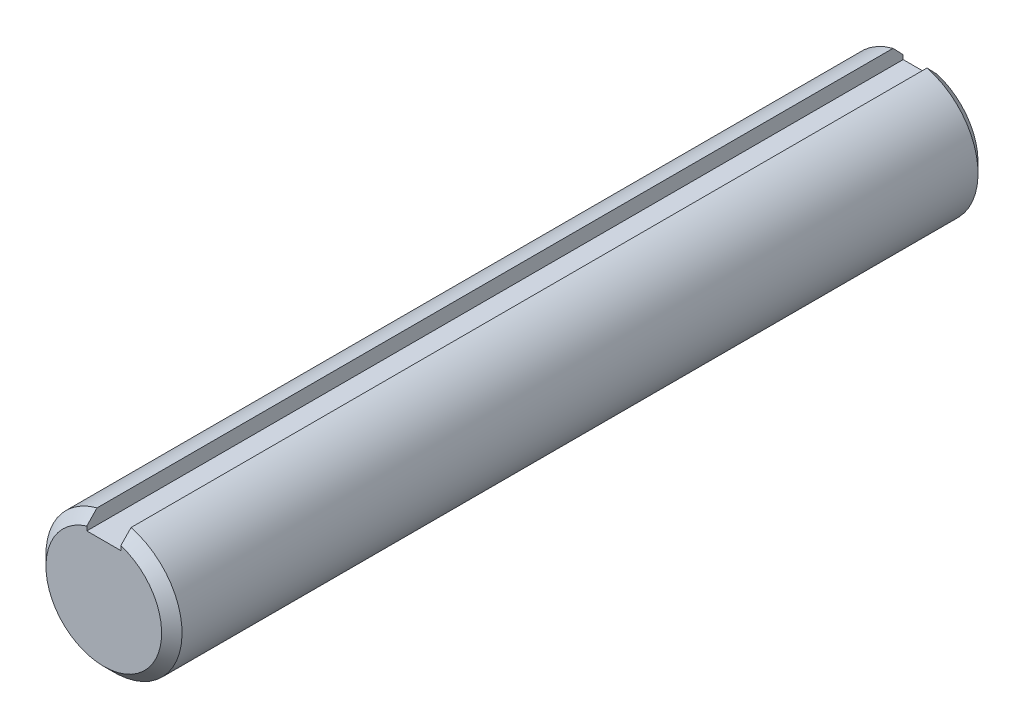
ISO-10303-21;
HEADER;
FILE_DESCRIPTION(('STEP AP214'),'2;1');
FILE_NAME('part.step','',(''),(''),'','','');
FILE_SCHEMA(('AUTOMOTIVE_DESIGN { 1 0 10303 214 1 1 1 1 }'));
ENDSEC;
DATA;
#1=APPLICATION_CONTEXT('core data for automotive mechanical design processes');
#2=APPLICATION_PROTOCOL_DEFINITION('international standard','automotive_design',2000,#1);
#3=PRODUCT_CONTEXT('',#1,'mechanical');
#4=PRODUCT('Part','Part','',(#3));
#5=PRODUCT_RELATED_PRODUCT_CATEGORY('part','',(#4));
#6=PRODUCT_DEFINITION_FORMATION('','',#4);
#7=PRODUCT_DEFINITION_CONTEXT('part definition',#1,'design');
#8=PRODUCT_DEFINITION('design','',#6,#7);
#9=PRODUCT_DEFINITION_SHAPE('','',#8);
#10=(LENGTH_UNIT() NAMED_UNIT(*) SI_UNIT(.MILLI.,.METRE.));
#11=(NAMED_UNIT(*) PLANE_ANGLE_UNIT() SI_UNIT($,.RADIAN.));
#12=(NAMED_UNIT(*) SI_UNIT($,.STERADIAN.) SOLID_ANGLE_UNIT());
#13=UNCERTAINTY_MEASURE_WITH_UNIT(LENGTH_MEASURE(1.E-05),#10,'distance_accuracy_value','');
#14=(GEOMETRIC_REPRESENTATION_CONTEXT(3) GLOBAL_UNCERTAINTY_ASSIGNED_CONTEXT((#13)) GLOBAL_UNIT_ASSIGNED_CONTEXT((#10,
#11,#12)) REPRESENTATION_CONTEXT('',''));
#15=CARTESIAN_POINT('',(0.,0.,0.));
#16=DIRECTION('',(0.,0.,1.));
#17=DIRECTION('',(1.,0.,0.));
#18=AXIS2_PLACEMENT_3D('',#15,#16,#17);
#19=CARTESIAN_POINT('',(0.,0.,38.1));
#20=DIRECTION('',(0.,0.,-1.));
#21=DIRECTION('',(-1.,0.,0.));
#22=AXIS2_PLACEMENT_3D('',#19,#20,#21);
#23=CYLINDRICAL_SURFACE('',#22,6.35);
#24=CARTESIAN_POINT('',(0.,0.,37.1475));
#25=DIRECTION('',(0.,0.,1.));
#26=DIRECTION('',(1.,0.,0.));
#27=AXIS2_PLACEMENT_3D('',#24,#25,#26);
#28=CIRCLE('',#27,6.35);
#29=CARTESIAN_POINT('',(1.5875,6.14836106210427,37.1475));
#30=VERTEX_POINT('',#29);
#31=CARTESIAN_POINT('',(-1.5875,6.14836106210427,37.1475));
#32=VERTEX_POINT('',#31);
#33=EDGE_CURVE('E156',#30,#32,#28,.F.);
#34=ORIENTED_EDGE('',*,*,#33,.T.);
#35=DIRECTION('',(0.,0.,-1.));
#36=VECTOR('',#35,1.);
#37=CARTESIAN_POINT('',(-1.5875,6.14836106210427,38.1));
#38=LINE('',#37,#36);
#39=CARTESIAN_POINT('',(-1.5875,6.14836106210427,-37.1474999999999));
#40=VERTEX_POINT('',#39);
#41=EDGE_CURVE('E133',#32,#40,#38,.T.);
#42=ORIENTED_EDGE('',*,*,#41,.T.);
#43=CARTESIAN_POINT('',(0.,0.,-37.1474999999999));
#44=DIRECTION('',(0.,0.,1.));
#45=DIRECTION('',(1.,0.,0.));
#46=AXIS2_PLACEMENT_3D('',#43,#44,#45);
#47=CIRCLE('',#46,6.35);
#48=CARTESIAN_POINT('',(1.5875,6.14836106210427,-37.1474999999999));
#49=VERTEX_POINT('',#48);
#50=EDGE_CURVE('E153',#40,#49,#47,.T.);
#51=ORIENTED_EDGE('',*,*,#50,.T.);
#52=DIRECTION('',(0.,0.,-1.));
#53=VECTOR('',#52,1.);
#54=CARTESIAN_POINT('',(1.5875,6.14836106210427,38.1));
#55=LINE('',#54,#53);
#56=EDGE_CURVE('E122',#49,#30,#55,.F.);
#57=ORIENTED_EDGE('',*,*,#56,.T.);
#58=EDGE_LOOP('',(#34,#42,#51,#57));
#59=FACE_BOUND('',#58,.T.);
#60=ADVANCED_FACE('F36',(#59),#23,.T.);
#61=CARTESIAN_POINT('',(0.,0.,38.1));
#62=DIRECTION('',(0.,0.,1.));
#63=DIRECTION('',(1.,0.,0.));
#64=AXIS2_PLACEMENT_3D('',#61,#62,#63);
#65=PLANE('',#64);
#66=DIRECTION('',(0.,-1.,0.));
#67=VECTOR('',#66,1.);
#68=CARTESIAN_POINT('',(-1.5875,6.35,38.1));
#69=LINE('',#68,#67);
#70=CARTESIAN_POINT('',(-1.5875,5.15876438694387,38.1));
#71=VERTEX_POINT('',#70);
#72=CARTESIAN_POINT('',(-1.5875,4.7625,38.1));
#73=VERTEX_POINT('',#72);
#74=EDGE_CURVE('E92',#71,#73,#69,.T.);
#75=ORIENTED_EDGE('',*,*,#74,.F.);
#76=CARTESIAN_POINT('',(0.,0.,38.1));
#77=DIRECTION('',(0.,0.,1.));
#78=DIRECTION('',(1.,0.,0.));
#79=AXIS2_PLACEMENT_3D('',#76,#77,#78);
#80=CIRCLE('',#79,5.39750000000003);
#81=CARTESIAN_POINT('',(1.5875,5.15876438694387,38.1));
#82=VERTEX_POINT('',#81);
#83=EDGE_CURVE('E148',#71,#82,#80,.T.);
#84=ORIENTED_EDGE('',*,*,#83,.T.);
#85=DIRECTION('',(0.,1.,0.));
#86=VECTOR('',#85,1.);
#87=CARTESIAN_POINT('',(1.5875,6.35,38.1));
#88=LINE('',#87,#86);
#89=CARTESIAN_POINT('',(1.5875,4.7625,38.1));
#90=VERTEX_POINT('',#89);
#91=EDGE_CURVE('E57',#90,#82,#88,.T.);
#92=ORIENTED_EDGE('',*,*,#91,.F.);
#93=DIRECTION('',(1.,0.,0.));
#94=VECTOR('',#93,1.);
#95=CARTESIAN_POINT('',(-1.5875,4.7625,38.1));
#96=LINE('',#95,#94);
#97=EDGE_CURVE('E102',#73,#90,#96,.T.);
#98=ORIENTED_EDGE('',*,*,#97,.F.);
#99=EDGE_LOOP('',(#75,#84,#92,#98));
#100=FACE_BOUND('',#99,.T.);
#101=ADVANCED_FACE('F113',(#100),#65,.T.);
#102=CARTESIAN_POINT('',(0.,0.,-38.1));
#103=DIRECTION('',(0.,0.,1.));
#104=DIRECTION('',(1.,0.,0.));
#105=AXIS2_PLACEMENT_3D('',#102,#103,#104);
#106=PLANE('',#105);
#107=CARTESIAN_POINT('',(0.,0.,-38.1));
#108=DIRECTION('',(0.,0.,1.));
#109=DIRECTION('',(1.,0.,0.));
#110=AXIS2_PLACEMENT_3D('',#107,#108,#109);
#111=CIRCLE('',#110,5.39749999999991);
#112=CARTESIAN_POINT('',(1.5875,5.15876438694374,-38.1));
#113=VERTEX_POINT('',#112);
#114=CARTESIAN_POINT('',(-1.5875,5.15876438694374,-38.1));
#115=VERTEX_POINT('',#114);
#116=EDGE_CURVE('E150',#113,#115,#111,.F.);
#117=ORIENTED_EDGE('',*,*,#116,.T.);
#118=DIRECTION('',(0.,-1.,0.));
#119=VECTOR('',#118,1.);
#120=CARTESIAN_POINT('',(-1.5875,6.35,-38.1));
#121=LINE('',#120,#119);
#122=CARTESIAN_POINT('',(-1.5875,4.7625,-38.1));
#123=VERTEX_POINT('',#122);
#124=EDGE_CURVE('E115',#115,#123,#121,.T.);
#125=ORIENTED_EDGE('',*,*,#124,.T.);
#126=DIRECTION('',(1.,0.,0.));
#127=VECTOR('',#126,1.);
#128=CARTESIAN_POINT('',(-1.5875,4.7625,-38.1));
#129=LINE('',#128,#127);
#130=CARTESIAN_POINT('',(1.5875,4.7625,-38.1));
#131=VERTEX_POINT('',#130);
#132=EDGE_CURVE('E108',#123,#131,#129,.T.);
#133=ORIENTED_EDGE('',*,*,#132,.T.);
#134=DIRECTION('',(0.,1.,0.));
#135=VECTOR('',#134,1.);
#136=CARTESIAN_POINT('',(1.5875,6.35,-38.1));
#137=LINE('',#136,#135);
#138=EDGE_CURVE('E111',#131,#113,#137,.T.);
#139=ORIENTED_EDGE('',*,*,#138,.T.);
#140=EDGE_LOOP('',(#117,#125,#133,#139));
#141=FACE_BOUND('',#140,.T.);
#142=ADVANCED_FACE('F168',(#141),#106,.F.);
#143=CARTESIAN_POINT('',(0.,0.,-37.1474999999999));
#144=DIRECTION('',(0.,0.,1.));
#145=DIRECTION('',(1.,0.,0.));
#146=AXIS2_PLACEMENT_3D('',#143,#144,#145);
#147=CONICAL_SURFACE('',#146,6.35,0.785398163397448);
#148=CARTESIAN_POINT('',(-1.5875,2.50467512422008,-40.5321073231548));
#149=CARTESIAN_POINT('',(-1.5875,2.61995748799084,-40.4346705663947));
#150=CARTESIAN_POINT('',(-1.5875,2.73434819416608,-40.3361940960173));
#151=CARTESIAN_POINT('',(-1.5875,2.96171067705001,-40.1376318023626));
#152=CARTESIAN_POINT('',(-1.5875,3.07468256144116,-40.0375461025497));
#153=CARTESIAN_POINT('',(-1.5875,3.29956921576396,-39.8362383617078));
#154=CARTESIAN_POINT('',(-1.5875,3.41148417069847,-39.7350165265981));
#155=CARTESIAN_POINT('',(-1.5875,3.63450717009297,-39.5316835974312));
#156=CARTESIAN_POINT('',(-1.5875,3.74561519672358,-39.4295724838341));
#157=CARTESIAN_POINT('',(-1.5875,4.07794041463343,-39.122275163923));
#158=CARTESIAN_POINT('',(-1.5875,4.29821694512228,-38.9160724676453));
#159=CARTESIAN_POINT('',(-1.5875,4.73715914530379,-38.5019423042723));
#160=CARTESIAN_POINT('',(-1.5875,4.95582472940176,-38.2940147467597));
#161=CARTESIAN_POINT('',(-1.5875,5.39197585155532,-37.8770487299095));
#162=CARTESIAN_POINT('',(-1.5875,5.60946170363257,-37.6680105987989));
#163=CARTESIAN_POINT('',(-1.5875,6.04362892921902,-37.2491110156674));
#164=CARTESIAN_POINT('',(-1.5875,6.26031032050705,-37.0392495820551));
#165=CARTESIAN_POINT('',(-1.5875,6.69313054205313,-36.6188746527964));
#166=CARTESIAN_POINT('',(-1.5875,6.90926924461324,-36.4083610257473));
#167=CARTESIAN_POINT('',(-1.5875,7.34108970538697,-35.9868665375563));
#168=CARTESIAN_POINT('',(-1.5875,7.55677146466178,-35.7758856775018));
#169=CARTESIAN_POINT('',(-1.5875,7.77229162734195,-35.5647404933434));
#170=B_SPLINE_CURVE_WITH_KNOTS('',3,(#148,#149,#150,#151,#152,#153,#154,#155,#156,#157,#158,
#159,#160,#161,#162,#163,#164,#165,#166,#167,#168,#169),.UNSPECIFIED.,.F.,.F.,(4,2,2,2,2,2,2,2,
2,2,4),(0.,0.452810247519127,0.905585918444124,1.35828081011677,1.81098567399956,
2.7161602553463,3.62138258954868,4.5263508176059,5.43129892508635,6.3364430635277,
7.2415850976004),.UNSPECIFIED.);
#171=EDGE_CURVE('E65',#115,#40,#170,.T.);
#172=ORIENTED_EDGE('',*,*,#171,.F.);
#173=ORIENTED_EDGE('',*,*,#116,.F.);
#174=CARTESIAN_POINT('',(1.5875,7.77229162734195,-35.5647404933434));
#175=CARTESIAN_POINT('',(1.5875,7.55677146466178,-35.7758856775018));
#176=CARTESIAN_POINT('',(1.5875,7.34108970538697,-35.9868665375563));
#177=CARTESIAN_POINT('',(1.5875,6.90926924461324,-36.4083610257473));
#178=CARTESIAN_POINT('',(1.5875,6.69313054205313,-36.6188746527964));
#179=CARTESIAN_POINT('',(1.5875,6.26031032050704,-37.0392495820551));
#180=CARTESIAN_POINT('',(1.5875,6.04362892921902,-37.2491110156674));
#181=CARTESIAN_POINT('',(1.5875,5.60946170363257,-37.6680105987989));
#182=CARTESIAN_POINT('',(1.5875,5.39197585155531,-37.8770487299095));
#183=CARTESIAN_POINT('',(1.5875,4.95582472940176,-38.2940147467597));
#184=CARTESIAN_POINT('',(1.5875,4.73715914530379,-38.5019423042723));
#185=CARTESIAN_POINT('',(1.5875,4.29821694512228,-38.9160724676453));
#186=CARTESIAN_POINT('',(1.5875,4.07794041463343,-39.122275163923));
#187=CARTESIAN_POINT('',(1.5875,3.74561519672358,-39.4295724838341));
#188=CARTESIAN_POINT('',(1.5875,3.63450717009297,-39.5316835974312));
#189=CARTESIAN_POINT('',(1.5875,3.41148417069847,-39.7350165265981));
#190=CARTESIAN_POINT('',(1.5875,3.29956921576396,-39.8362383617078));
#191=CARTESIAN_POINT('',(1.5875,3.07468256144116,-40.0375461025497));
#192=CARTESIAN_POINT('',(1.5875,2.96171067705001,-40.1376318023626));
#193=CARTESIAN_POINT('',(1.5875,2.73434819416608,-40.3361940960173));
#194=CARTESIAN_POINT('',(1.5875,2.61995748799084,-40.4346705663947));
#195=CARTESIAN_POINT('',(1.5875,2.50467512422008,-40.5321073231548));
#196=B_SPLINE_CURVE_WITH_KNOTS('',3,(#174,#175,#176,#177,#178,#179,#180,#181,#182,#183,#184,
#185,#186,#187,#188,#189,#190,#191,#192,#193,#194,#195),.UNSPECIFIED.,.F.,.F.,(4,2,2,2,2,2,2,2,
2,2,4),(0.,0.905142034072701,1.81028617251405,2.71523427999449,3.62020250805171,4.5254248422541,
5.43059942360083,5.88330428748363,6.33599917915627,6.78877485008127,7.2415850976004),.UNSPECIFIED.);
#197=EDGE_CURVE('E126',#49,#113,#196,.T.);
#198=ORIENTED_EDGE('',*,*,#197,.F.);
#199=ORIENTED_EDGE('',*,*,#50,.F.);
#200=EDGE_LOOP('',(#172,#173,#198,#199));
#201=FACE_BOUND('',#200,.T.);
#202=ADVANCED_FACE('F135',(#201),#147,.T.);
#203=CARTESIAN_POINT('',(0.,0.,38.1));
#204=DIRECTION('',(0.,0.,-1.));
#205=DIRECTION('',(-1.,0.,0.));
#206=AXIS2_PLACEMENT_3D('',#203,#204,#205);
#207=CONICAL_SURFACE('',#206,5.39750000000003,0.785398163397448);
#208=CARTESIAN_POINT('',(-1.5875,7.77229162734194,35.5647404933435));
#209=CARTESIAN_POINT('',(-1.5875,7.55677146466177,35.775885677502));
#210=CARTESIAN_POINT('',(-1.5875,7.34108970538697,35.9868665375564));
#211=CARTESIAN_POINT('',(-1.5875,6.90926924461324,36.4083610257474));
#212=CARTESIAN_POINT('',(-1.5875,6.69313054205314,36.6188746527965));
#213=CARTESIAN_POINT('',(-1.5875,6.26031032050706,37.0392495820552));
#214=CARTESIAN_POINT('',(-1.5875,6.04362892921904,37.2491110156675));
#215=CARTESIAN_POINT('',(-1.5875,5.60946170363261,37.668010598799));
#216=CARTESIAN_POINT('',(-1.5875,5.39197585155535,37.8770487299096));
#217=CARTESIAN_POINT('',(-1.5875,4.95582472940181,38.2940147467598));
#218=CARTESIAN_POINT('',(-1.5875,4.73715914530385,38.5019423042723));
#219=CARTESIAN_POINT('',(-1.5875,4.29821694512235,38.9160724676454));
#220=CARTESIAN_POINT('',(-1.5875,4.0779404146335,39.122275163923));
#221=CARTESIAN_POINT('',(-1.5875,3.74561519672367,39.4295724838341));
#222=CARTESIAN_POINT('',(-1.5875,3.63450717009305,39.5316835974313));
#223=CARTESIAN_POINT('',(-1.5875,3.41148417069856,39.7350165265982));
#224=CARTESIAN_POINT('',(-1.5875,3.29956921576405,39.8362383617079));
#225=CARTESIAN_POINT('',(-1.5875,3.07468256144125,40.0375461025497));
#226=CARTESIAN_POINT('',(-1.5875,2.9617106770501,40.1376318023627));
#227=CARTESIAN_POINT('',(-1.5875,2.73434819416618,40.3361940960174));
#228=CARTESIAN_POINT('',(-1.5875,2.61995748799095,40.4346705663947));
#229=CARTESIAN_POINT('',(-1.5875,2.50467512422019,40.5321073231548));
#230=B_SPLINE_CURVE_WITH_KNOTS('',3,(#208,#209,#210,#211,#212,#213,#214,#215,#216,#217,#218,
#219,#220,#221,#222,#223,#224,#225,#226,#227,#228,#229),.UNSPECIFIED.,.F.,.F.,(4,2,2,2,2,2,2,2,
2,2,4),(0.,0.905142034072683,1.81028617251402,2.71523427999444,3.62020250805164,
4.52542484225399,5.4305994236007,5.88330428748349,6.33599917915613,6.78877485008111,
7.24158509760024),.UNSPECIFIED.);
#231=EDGE_CURVE('E11',#32,#71,#230,.T.);
#232=ORIENTED_EDGE('',*,*,#231,.F.);
#233=ORIENTED_EDGE('',*,*,#33,.F.);
#234=CARTESIAN_POINT('',(1.5875,2.50467512422019,40.5321073231548));
#235=CARTESIAN_POINT('',(1.5875,2.61995748799094,40.4346705663947));
#236=CARTESIAN_POINT('',(1.5875,2.73434819416618,40.3361940960174));
#237=CARTESIAN_POINT('',(1.5875,2.9617106770501,40.1376318023627));
#238=CARTESIAN_POINT('',(1.5875,3.07468256144125,40.0375461025497));
#239=CARTESIAN_POINT('',(1.5875,3.29956921576405,39.8362383617079));
#240=CARTESIAN_POINT('',(1.5875,3.41148417069856,39.7350165265982));
#241=CARTESIAN_POINT('',(1.5875,3.63450717009305,39.5316835974313));
#242=CARTESIAN_POINT('',(1.5875,3.74561519672366,39.4295724838341));
#243=CARTESIAN_POINT('',(1.5875,4.0779404146335,39.122275163923));
#244=CARTESIAN_POINT('',(1.5875,4.29821694512235,38.9160724676454));
#245=CARTESIAN_POINT('',(1.5875,4.73715914530384,38.5019423042723));
#246=CARTESIAN_POINT('',(1.5875,4.95582472940181,38.2940147467598));
#247=CARTESIAN_POINT('',(1.5875,5.39197585155535,37.8770487299096));
#248=CARTESIAN_POINT('',(1.5875,5.60946170363261,37.668010598799));
#249=CARTESIAN_POINT('',(1.5875,6.04362892921904,37.2491110156675));
#250=CARTESIAN_POINT('',(1.5875,6.26031032050706,37.0392495820552));
#251=CARTESIAN_POINT('',(1.5875,6.69313054205314,36.6188746527965));
#252=CARTESIAN_POINT('',(1.5875,6.90926924461324,36.4083610257474));
#253=CARTESIAN_POINT('',(1.5875,7.34108970538697,35.9868665375564));
#254=CARTESIAN_POINT('',(1.5875,7.55677146466177,35.775885677502));
#255=CARTESIAN_POINT('',(1.5875,7.77229162734194,35.5647404933435));
#256=B_SPLINE_CURVE_WITH_KNOTS('',3,(#234,#235,#236,#237,#238,#239,#240,#241,#242,#243,#244,
#245,#246,#247,#248,#249,#250,#251,#252,#253,#254,#255),.UNSPECIFIED.,.F.,.F.,(4,2,2,2,2,2,2,2,
2,2,4),(0.,0.452810247519121,0.905585918444104,1.35828081011673,1.81098567399952,
2.71616025534624,3.6213825895486,4.5263508176058,5.43129892508622,6.33644306352756,
7.24158509760024),.UNSPECIFIED.);
#257=EDGE_CURVE('E50',#82,#30,#256,.T.);
#258=ORIENTED_EDGE('',*,*,#257,.F.);
#259=ORIENTED_EDGE('',*,*,#83,.F.);
#260=EDGE_LOOP('',(#232,#233,#258,#259));
#261=FACE_BOUND('',#260,.T.);
#262=ADVANCED_FACE('F38',(#261),#207,.T.);
#263=CARTESIAN_POINT('',(-1.5875,6.35,-38.1));
#264=DIRECTION('',(-1.,0.,0.));
#265=DIRECTION('',(0.,-1.,0.));
#266=AXIS2_PLACEMENT_3D('',#263,#264,#265);
#267=PLANE('',#266);
#268=ORIENTED_EDGE('',*,*,#171,.T.);
#269=ORIENTED_EDGE('',*,*,#41,.F.);
#270=ORIENTED_EDGE('',*,*,#231,.T.);
#271=ORIENTED_EDGE('',*,*,#74,.T.);
#272=DIRECTION('',(0.,0.,1.));
#273=VECTOR('',#272,1.);
#274=CARTESIAN_POINT('',(-1.5875,4.7625,-38.1));
#275=LINE('',#274,#273);
#276=EDGE_CURVE('E95',#123,#73,#275,.T.);
#277=ORIENTED_EDGE('',*,*,#276,.F.);
#278=ORIENTED_EDGE('',*,*,#124,.F.);
#279=EDGE_LOOP('',(#268,#269,#270,#271,#277,#278));
#280=FACE_BOUND('',#279,.T.);
#281=ADVANCED_FACE('F94',(#280),#267,.F.);
#282=CARTESIAN_POINT('',(1.5875,6.35,-38.1));
#283=DIRECTION('',(1.,0.,0.));
#284=DIRECTION('',(0.,1.,0.));
#285=AXIS2_PLACEMENT_3D('',#282,#283,#284);
#286=PLANE('',#285);
#287=ORIENTED_EDGE('',*,*,#197,.T.);
#288=ORIENTED_EDGE('',*,*,#138,.F.);
#289=DIRECTION('',(0.,0.,1.));
#290=VECTOR('',#289,1.);
#291=CARTESIAN_POINT('',(1.5875,4.7625,-38.1));
#292=LINE('',#291,#290);
#293=EDGE_CURVE('E110',#131,#90,#292,.T.);
#294=ORIENTED_EDGE('',*,*,#293,.T.);
#295=ORIENTED_EDGE('',*,*,#91,.T.);
#296=ORIENTED_EDGE('',*,*,#257,.T.);
#297=ORIENTED_EDGE('',*,*,#56,.F.);
#298=EDGE_LOOP('',(#287,#288,#294,#295,#296,#297));
#299=FACE_BOUND('',#298,.T.);
#300=ADVANCED_FACE('F138',(#299),#286,.F.);
#301=CARTESIAN_POINT('',(-1.5875,4.7625,-38.1));
#302=DIRECTION('',(0.,-1.,0.));
#303=DIRECTION('',(0.,0.,-1.));
#304=AXIS2_PLACEMENT_3D('',#301,#302,#303);
#305=PLANE('',#304);
#306=ORIENTED_EDGE('',*,*,#293,.F.);
#307=ORIENTED_EDGE('',*,*,#132,.F.);
#308=ORIENTED_EDGE('',*,*,#276,.T.);
#309=ORIENTED_EDGE('',*,*,#97,.T.);
#310=EDGE_LOOP('',(#306,#307,#308,#309));
#311=FACE_BOUND('',#310,.T.);
#312=ADVANCED_FACE('F106',(#311),#305,.F.);
#313=CLOSED_SHELL('',(#60,#101,#142,#202,#262,#281,#300,#312));
#314=MANIFOLD_SOLID_BREP('B2',#313);
#315=ADVANCED_BREP_SHAPE_REPRESENTATION('',(#18,#314),#14);
#316=SHAPE_DEFINITION_REPRESENTATION(#9,#315);
ENDSEC;
END-ISO-10303-21;
